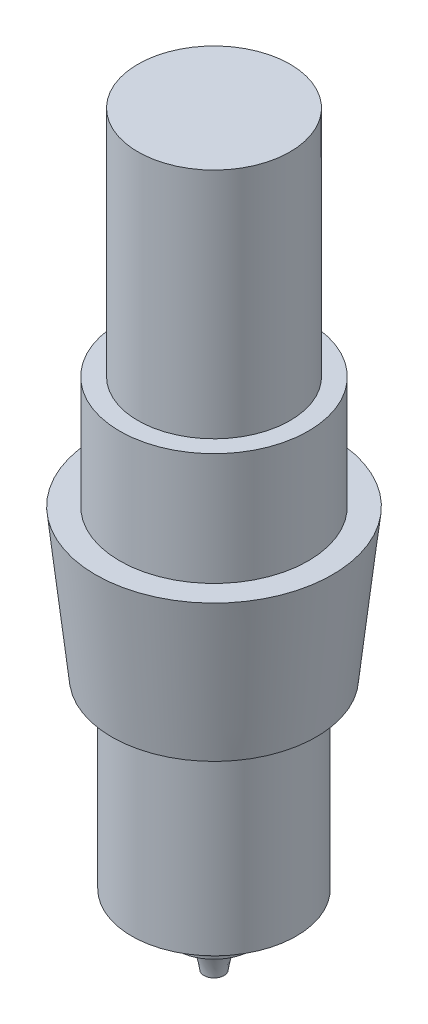
ISO-10303-21;
HEADER;
FILE_DESCRIPTION(('STEP AP214'),'2;1');
FILE_NAME('part.step','',(''),(''),'','','');
FILE_SCHEMA(('AUTOMOTIVE_DESIGN { 1 0 10303 214 1 1 1 1 }'));
ENDSEC;
DATA;
#1=APPLICATION_CONTEXT('core data for automotive mechanical design processes');
#2=APPLICATION_PROTOCOL_DEFINITION('international standard','automotive_design',2000,#1);
#3=PRODUCT_CONTEXT('',#1,'mechanical');
#4=PRODUCT('Part','Part','',(#3));
#5=PRODUCT_RELATED_PRODUCT_CATEGORY('part','',(#4));
#6=PRODUCT_DEFINITION_FORMATION('','',#4);
#7=PRODUCT_DEFINITION_CONTEXT('part definition',#1,'design');
#8=PRODUCT_DEFINITION('design','',#6,#7);
#9=PRODUCT_DEFINITION_SHAPE('','',#8);
#10=(LENGTH_UNIT() NAMED_UNIT(*) SI_UNIT(.MILLI.,.METRE.));
#11=(NAMED_UNIT(*) PLANE_ANGLE_UNIT() SI_UNIT($,.RADIAN.));
#12=(NAMED_UNIT(*) SI_UNIT($,.STERADIAN.) SOLID_ANGLE_UNIT());
#13=UNCERTAINTY_MEASURE_WITH_UNIT(LENGTH_MEASURE(1.E-05),#10,'distance_accuracy_value','');
#14=(GEOMETRIC_REPRESENTATION_CONTEXT(3) GLOBAL_UNCERTAINTY_ASSIGNED_CONTEXT((#13)) GLOBAL_UNIT_ASSIGNED_CONTEXT((#10,
#11,#12)) REPRESENTATION_CONTEXT('',''));
#15=CARTESIAN_POINT('',(0.,0.,0.));
#16=DIRECTION('',(0.,0.,1.));
#17=DIRECTION('',(1.,0.,0.));
#18=AXIS2_PLACEMENT_3D('',#15,#16,#17);
#19=CARTESIAN_POINT('',(0.,-119.,0.));
#20=DIRECTION('',(0.,-1.,0.));
#21=DIRECTION('',(0.,0.,-1.));
#22=AXIS2_PLACEMENT_3D('',#19,#20,#21);
#23=PLANE('',#22);
#24=CARTESIAN_POINT('',(0.,-119.,0.));
#25=DIRECTION('',(0.,-1.,0.));
#26=DIRECTION('',(0.,0.,-1.));
#27=AXIS2_PLACEMENT_3D('',#24,#25,#26);
#28=CIRCLE('',#27,9.5);
#29=CARTESIAN_POINT('',(6.8013965887074,-119.,6.63257148043799));
#30=VERTEX_POINT('',#29);
#31=EDGE_CURVE('E128',#30,#30,#28,.T.);
#32=ORIENTED_EDGE('',*,*,#31,.T.);
#33=EDGE_LOOP('',(#32));
#34=FACE_BOUND('',#33,.T.);
#35=CARTESIAN_POINT('',(0.,-119.,0.));
#36=DIRECTION('',(0.,-1.,0.));
#37=DIRECTION('',(0.,0.,-1.));
#38=AXIS2_PLACEMENT_3D('',#35,#36,#37);
#39=CIRCLE('',#38,5.);
#40=CARTESIAN_POINT('',(-4.99352595014576,-119.,-0.254359165788987));
#41=VERTEX_POINT('',#40);
#42=EDGE_CURVE('E141',#41,#41,#39,.T.);
#43=ORIENTED_EDGE('',*,*,#42,.F.);
#44=EDGE_LOOP('',(#43));
#45=FACE_BOUND('',#44,.T.);
#46=ADVANCED_FACE('F49',(#34,#45),#23,.T.);
#47=CARTESIAN_POINT('',(0.,58.,0.));
#48=DIRECTION('',(0.,-1.,0.));
#49=DIRECTION('',(0.,0.,-1.));
#50=AXIS2_PLACEMENT_3D('',#47,#48,#49);
#51=CYLINDRICAL_SURFACE('',#50,18.95);
#52=CARTESIAN_POINT('',(0.,58.,0.));
#53=DIRECTION('',(0.,1.,0.));
#54=DIRECTION('',(0.,0.,1.));
#55=AXIS2_PLACEMENT_3D('',#52,#53,#54);
#56=CIRCLE('',#55,18.95);
#57=CARTESIAN_POINT('',(0.,58.,-18.95));
#58=VERTEX_POINT('',#57);
#59=EDGE_CURVE('E58',#58,#58,#56,.T.);
#60=CARTESIAN_POINT('',(0.,0.,0.));
#61=DIRECTION('',(0.,1.,0.));
#62=DIRECTION('',(0.,0.,1.));
#63=AXIS2_PLACEMENT_3D('',#60,#61,#62);
#64=CIRCLE('',#63,18.95);
#65=CARTESIAN_POINT('',(0.,0.,-18.95));
#66=VERTEX_POINT('',#65);
#67=EDGE_CURVE('E64',#66,#66,#64,.T.);
#68=CARTESIAN_POINT('',(0.,58.,-18.95));
#69=CARTESIAN_POINT('',(0.,57.3958333333333,-18.95));
#70=CARTESIAN_POINT('',(0.,56.7916666666667,-18.95));
#71=CARTESIAN_POINT('',(0.,55.5833333333333,-18.95));
#72=CARTESIAN_POINT('',(0.,54.9791666666667,-18.95));
#73=CARTESIAN_POINT('',(0.,53.7708333333333,-18.95));
#74=CARTESIAN_POINT('',(0.,53.1666666666667,-18.95));
#75=CARTESIAN_POINT('',(0.,51.9583333333333,-18.95));
#76=CARTESIAN_POINT('',(0.,51.3541666666667,-18.95));
#77=CARTESIAN_POINT('',(0.,50.1458333333333,-18.95));
#78=CARTESIAN_POINT('',(0.,49.5416666666667,-18.95));
#79=CARTESIAN_POINT('',(0.,48.3333333333333,-18.95));
#80=CARTESIAN_POINT('',(0.,47.7291666666667,-18.95));
#81=CARTESIAN_POINT('',(0.,46.5208333333333,-18.95));
#82=CARTESIAN_POINT('',(0.,45.9166666666667,-18.95));
#83=CARTESIAN_POINT('',(0.,44.7083333333333,-18.95));
#84=CARTESIAN_POINT('',(0.,44.1041666666667,-18.95));
#85=CARTESIAN_POINT('',(0.,42.8958333333333,-18.95));
#86=CARTESIAN_POINT('',(0.,42.2916666666667,-18.95));
#87=CARTESIAN_POINT('',(0.,41.0833333333333,-18.95));
#88=CARTESIAN_POINT('',(0.,40.4791666666667,-18.95));
#89=CARTESIAN_POINT('',(0.,39.2708333333333,-18.95));
#90=CARTESIAN_POINT('',(0.,38.6666666666667,-18.95));
#91=CARTESIAN_POINT('',(0.,37.4583333333333,-18.95));
#92=CARTESIAN_POINT('',(0.,36.8541666666667,-18.95));
#93=CARTESIAN_POINT('',(0.,35.6458333333333,-18.95));
#94=CARTESIAN_POINT('',(0.,35.0416666666667,-18.95));
#95=CARTESIAN_POINT('',(0.,33.8333333333333,-18.95));
#96=CARTESIAN_POINT('',(0.,33.2291666666667,-18.95));
#97=CARTESIAN_POINT('',(0.,32.0208333333333,-18.95));
#98=CARTESIAN_POINT('',(0.,31.4166666666667,-18.95));
#99=CARTESIAN_POINT('',(0.,30.2083333333333,-18.95));
#100=CARTESIAN_POINT('',(0.,29.6041666666667,-18.95));
#101=CARTESIAN_POINT('',(0.,28.3958333333333,-18.95));
#102=CARTESIAN_POINT('',(0.,27.7916666666667,-18.95));
#103=CARTESIAN_POINT('',(0.,26.5833333333333,-18.95));
#104=CARTESIAN_POINT('',(0.,25.9791666666667,-18.95));
#105=CARTESIAN_POINT('',(0.,24.7708333333333,-18.95));
#106=CARTESIAN_POINT('',(0.,24.1666666666667,-18.95));
#107=CARTESIAN_POINT('',(0.,22.9583333333333,-18.95));
#108=CARTESIAN_POINT('',(0.,22.3541666666667,-18.95));
#109=CARTESIAN_POINT('',(0.,21.1458333333333,-18.95));
#110=CARTESIAN_POINT('',(0.,20.5416666666667,-18.95));
#111=CARTESIAN_POINT('',(0.,19.3333333333333,-18.95));
#112=CARTESIAN_POINT('',(0.,18.7291666666667,-18.95));
#113=CARTESIAN_POINT('',(0.,17.5208333333333,-18.95));
#114=CARTESIAN_POINT('',(0.,16.9166666666667,-18.95));
#115=CARTESIAN_POINT('',(0.,15.7083333333333,-18.95));
#116=CARTESIAN_POINT('',(0.,15.1041666666667,-18.95));
#117=CARTESIAN_POINT('',(0.,13.8958333333333,-18.95));
#118=CARTESIAN_POINT('',(0.,13.2916666666667,-18.95));
#119=CARTESIAN_POINT('',(0.,12.0833333333333,-18.95));
#120=CARTESIAN_POINT('',(0.,11.4791666666667,-18.95));
#121=CARTESIAN_POINT('',(0.,10.2708333333333,-18.95));
#122=CARTESIAN_POINT('',(0.,9.66666666666667,-18.95));
#123=CARTESIAN_POINT('',(0.,8.45833333333333,-18.95));
#124=CARTESIAN_POINT('',(0.,7.85416666666667,-18.95));
#125=CARTESIAN_POINT('',(0.,6.64583333333333,-18.95));
#126=CARTESIAN_POINT('',(0.,6.04166666666667,-18.95));
#127=CARTESIAN_POINT('',(0.,4.83333333333333,-18.95));
#128=CARTESIAN_POINT('',(0.,4.22916666666667,-18.95));
#129=CARTESIAN_POINT('',(0.,3.02083333333334,-18.95));
#130=CARTESIAN_POINT('',(0.,2.41666666666667,-18.95));
#131=CARTESIAN_POINT('',(0.,1.20833333333333,-18.95));
#132=CARTESIAN_POINT('',(0.,0.604166666666666,-18.95));
#133=CARTESIAN_POINT('',(0.,0.,-18.95));
#134=B_SPLINE_CURVE_WITH_KNOTS('',3,(#68,#69,#70,#71,#72,#73,#74,#75,#76,#77,#78,#79,#80,#81,
#82,#83,#84,#85,#86,#87,#88,#89,#90,#91,#92,#93,#94,#95,#96,#97,#98,#99,#100,#101,#102,#103,
#104,#105,#106,#107,#108,#109,#110,#111,#112,#113,#114,#115,#116,#117,#118,#119,#120,#121,#122,
#123,#124,#125,#126,#127,#128,#129,#130,#131,#132,#133),.UNSPECIFIED.,.F.,.F.,(4,2,2,2,2,2,2,2,
2,2,2,2,2,2,2,2,2,2,2,2,2,2,2,2,2,2,2,2,2,2,2,2,4),(0.,1.8125,3.625,5.4375,7.25000000000001,
9.0625,10.875,12.6875,14.5,16.3125,18.125,19.9375,21.75,23.5625,25.375,27.1875,29.,30.8125,
32.625,34.4375,36.25,38.0625,39.875,41.6875,43.5,45.3125,47.125,48.9375,50.75,52.5625,54.375,
56.1875,58.),.UNSPECIFIED.);
#135=EDGE_CURVE('BSEAM51',#58,#66,#134,.T.);
#136=ORIENTED_EDGE('',*,*,#59,.F.);
#137=ORIENTED_EDGE('',*,*,#67,.T.);
#138=ORIENTED_EDGE('',*,*,#135,.T.);
#139=ORIENTED_EDGE('',*,*,#135,.F.);
#140=EDGE_LOOP('',(#136,#138,#137,#139));
#141=FACE_BOUND('',#140,.T.);
#142=ADVANCED_FACE('F51',(#141),#51,.T.);
#143=CARTESIAN_POINT('',(0.,58.,0.));
#144=DIRECTION('',(0.,1.,0.));
#145=DIRECTION('',(0.,0.,1.));
#146=AXIS2_PLACEMENT_3D('',#143,#144,#145);
#147=PLANE('',#146);
#148=ORIENTED_EDGE('',*,*,#59,.T.);
#149=EDGE_LOOP('',(#148));
#150=FACE_BOUND('',#149,.T.);
#151=ADVANCED_FACE('F261',(#150),#147,.T.);
#152=CARTESIAN_POINT('',(0.,-28.,0.));
#153=DIRECTION('',(0.,1.,0.));
#154=DIRECTION('',(0.,0.,1.));
#155=AXIS2_PLACEMENT_3D('',#152,#153,#154);
#156=CYLINDRICAL_SURFACE('',#155,23.5);
#157=CARTESIAN_POINT('',(0.,-28.,0.));
#158=DIRECTION('',(0.,-1.,0.));
#159=DIRECTION('',(0.,0.,-1.));
#160=AXIS2_PLACEMENT_3D('',#157,#158,#159);
#161=CIRCLE('',#160,23.5);
#162=CARTESIAN_POINT('',(0.,-28.,-23.5));
#163=VERTEX_POINT('',#162);
#164=EDGE_CURVE('E116',#163,#163,#161,.T.);
#165=ORIENTED_EDGE('',*,*,#164,.F.);
#166=EDGE_LOOP('',(#165));
#167=FACE_BOUND('',#166,.T.);
#168=CARTESIAN_POINT('',(0.,0.,0.));
#169=DIRECTION('',(0.,-1.,0.));
#170=DIRECTION('',(0.,0.,-1.));
#171=AXIS2_PLACEMENT_3D('',#168,#169,#170);
#172=CIRCLE('',#171,23.5);
#173=CARTESIAN_POINT('',(0.,0.,-23.5));
#174=VERTEX_POINT('',#173);
#175=EDGE_CURVE('E113',#174,#174,#172,.T.);
#176=ORIENTED_EDGE('',*,*,#175,.T.);
#177=EDGE_LOOP('',(#176));
#178=FACE_BOUND('',#177,.T.);
#179=ADVANCED_FACE('F254',(#167,#178),#156,.T.);
#180=CARTESIAN_POINT('',(0.,0.,0.));
#181=DIRECTION('',(0.,-1.,0.));
#182=DIRECTION('',(0.,0.,-1.));
#183=AXIS2_PLACEMENT_3D('',#180,#181,#182);
#184=PLANE('',#183);
#185=ORIENTED_EDGE('',*,*,#67,.F.);
#186=EDGE_LOOP('',(#185));
#187=FACE_BOUND('',#186,.T.);
#188=ORIENTED_EDGE('',*,*,#175,.F.);
#189=EDGE_LOOP('',(#188));
#190=FACE_BOUND('',#189,.T.);
#191=ADVANCED_FACE('F99',(#187,#190),#184,.F.);
#192=CARTESIAN_POINT('',(0.,-65.,0.));
#193=DIRECTION('',(0.,-1.,0.));
#194=DIRECTION('',(0.,0.,-1.));
#195=AXIS2_PLACEMENT_3D('',#192,#193,#194);
#196=PLANE('',#195);
#197=CARTESIAN_POINT('',(0.,-65.,0.));
#198=DIRECTION('',(0.,-1.,0.));
#199=DIRECTION('',(0.,0.,-1.));
#200=AXIS2_PLACEMENT_3D('',#197,#198,#199);
#201=CIRCLE('',#200,20.5);
#202=CARTESIAN_POINT('',(0.,-65.,-20.5));
#203=VERTEX_POINT('',#202);
#204=EDGE_CURVE('E11',#203,#203,#201,.T.);
#205=ORIENTED_EDGE('',*,*,#204,.F.);
#206=EDGE_LOOP('',(#205));
#207=FACE_BOUND('',#206,.T.);
#208=CARTESIAN_POINT('',(0.,-65.,0.));
#209=DIRECTION('',(0.,-1.,0.));
#210=DIRECTION('',(0.,0.,-1.));
#211=AXIS2_PLACEMENT_3D('',#208,#209,#210);
#212=CIRCLE('',#211,25.5);
#213=CARTESIAN_POINT('',(0.,-65.,-25.5));
#214=VERTEX_POINT('',#213);
#215=EDGE_CURVE('E74',#214,#214,#212,.T.);
#216=ORIENTED_EDGE('',*,*,#215,.T.);
#217=EDGE_LOOP('',(#216));
#218=FACE_BOUND('',#217,.T.);
#219=ADVANCED_FACE('F95',(#207,#218),#196,.T.);
#220=CARTESIAN_POINT('',(0.,-28.,0.));
#221=DIRECTION('',(0.,-1.,0.));
#222=DIRECTION('',(0.,0.,-1.));
#223=AXIS2_PLACEMENT_3D('',#220,#221,#222);
#224=PLANE('',#223);
#225=ORIENTED_EDGE('',*,*,#164,.T.);
#226=EDGE_LOOP('',(#225));
#227=FACE_BOUND('',#226,.T.);
#228=CARTESIAN_POINT('',(0.,-28.,0.));
#229=DIRECTION('',(0.,-1.,0.));
#230=DIRECTION('',(0.,0.,-1.));
#231=AXIS2_PLACEMENT_3D('',#228,#229,#230);
#232=CIRCLE('',#231,29.5);
#233=CARTESIAN_POINT('',(0.,-28.,-29.5));
#234=VERTEX_POINT('',#233);
#235=EDGE_CURVE('E79',#234,#234,#232,.T.);
#236=ORIENTED_EDGE('',*,*,#235,.F.);
#237=EDGE_LOOP('',(#236));
#238=FACE_BOUND('',#237,.T.);
#239=ADVANCED_FACE('F92',(#227,#238),#224,.F.);
#240=CARTESIAN_POINT('',(0.,-65.,0.));
#241=DIRECTION('',(0.,1.,0.));
#242=DIRECTION('',(0.,0.,1.));
#243=AXIS2_PLACEMENT_3D('',#240,#241,#242);
#244=CONICAL_SURFACE('',#243,25.5,0.107689870832821);
#245=ORIENTED_EDGE('',*,*,#235,.T.);
#246=EDGE_LOOP('',(#245));
#247=FACE_BOUND('',#246,.T.);
#248=ORIENTED_EDGE('',*,*,#215,.F.);
#249=EDGE_LOOP('',(#248));
#250=FACE_BOUND('',#249,.T.);
#251=ADVANCED_FACE('F81',(#247,#250),#244,.T.);
#252=CARTESIAN_POINT('',(0.,-110.5,0.));
#253=DIRECTION('',(0.,1.,0.));
#254=DIRECTION('',(0.,0.,1.));
#255=AXIS2_PLACEMENT_3D('',#252,#253,#254);
#256=CYLINDRICAL_SURFACE('',#255,20.5);
#257=CARTESIAN_POINT('',(0.,-110.5,0.));
#258=DIRECTION('',(0.,1.,0.));
#259=DIRECTION('',(0.,0.,1.));
#260=AXIS2_PLACEMENT_3D('',#257,#258,#259);
#261=CIRCLE('',#260,20.5);
#262=CARTESIAN_POINT('',(19.3227169404993,-110.5,-6.84708770480867));
#263=VERTEX_POINT('',#262);
#264=EDGE_CURVE('E125',#263,#263,#261,.F.);
#265=ORIENTED_EDGE('',*,*,#264,.F.);
#266=EDGE_LOOP('',(#265));
#267=FACE_BOUND('',#266,.T.);
#268=ORIENTED_EDGE('',*,*,#204,.T.);
#269=EDGE_LOOP('',(#268));
#270=FACE_BOUND('',#269,.T.);
#271=ADVANCED_FACE('F91',(#267,#270),#256,.T.);
#272=CARTESIAN_POINT('',(19.3227169404993,-110.5,-6.84708770480867));
#273=CARTESIAN_POINT('',(6.8013965887074,-119.,6.63257148043799));
#274=CARTESIAN_POINT('',(33.0168923501166,-110.5,31.7983461761899));
#275=CARTESIAN_POINT('',(-6.46374637216858,-119.,20.2353646578528));
#276=CARTESIAN_POINT('',(-5.62854153088193,-110.5,45.4925215858072));
#277=CARTESIAN_POINT('',(-20.0665395495834,-119.,6.97022169697681));
#278=CARTESIAN_POINT('',(-19.3227169404993,-110.5,6.84708770480868));
#279=CARTESIAN_POINT('',(-6.8013965887074,-119.,-6.63257148043799));
#280=CARTESIAN_POINT('',(-33.0168923501166,-110.5,-31.7983461761899));
#281=CARTESIAN_POINT('',(6.46374637216858,-119.,-20.2353646578528));
#282=CARTESIAN_POINT('',(5.62854153088193,-110.5,-45.4925215858072));
#283=CARTESIAN_POINT('',(20.0665395495834,-119.,-6.9702216969768));
#284=CARTESIAN_POINT('',(19.3227169404993,-110.5,-6.84708770480867));
#285=CARTESIAN_POINT('',(6.8013965887074,-119.,6.63257148043799));
#286=(BOUNDED_SURFACE() B_SPLINE_SURFACE(3,1,((#272,#273),(#274,#275),(#276,#277),(#278,#279),
(#280,#281),(#282,#283),(#284,#285)),.UNSPECIFIED.,.T.,.F.,.F.) B_SPLINE_SURFACE_WITH_KNOTS((4,
3,4),(2,2),(0.,0.5,1.),(0.,1.),
.UNSPECIFIED.) GEOMETRIC_REPRESENTATION_ITEM() RATIONAL_B_SPLINE_SURFACE(((1.,1.),
(0.333333333333334,0.333333333333333),(0.333333333333334,0.333333333333333),(1.,1.),
(0.333333333333333,0.333333333333333),(0.333333333333333,0.333333333333333),(1.,1.))) REPRESENTATION_ITEM('') SURFACE());
#287=CARTESIAN_POINT('',(19.3227169404993,-110.5,-6.84708770480867));
#288=CARTESIAN_POINT('',(19.1922865201681,-110.588541666667,-6.70667458829568));
#289=CARTESIAN_POINT('',(19.061856099837,-110.677083333333,-6.5662614717827));
#290=CARTESIAN_POINT('',(18.8009952591746,-110.854166666667,-6.28543523875672));
#291=CARTESIAN_POINT('',(18.6705648388435,-110.942708333333,-6.14502212224374));
#292=CARTESIAN_POINT('',(18.4097039981811,-111.119791666667,-5.86419588921777));
#293=CARTESIAN_POINT('',(18.27927357785,-111.208333333333,-5.72378277270478));
#294=CARTESIAN_POINT('',(18.0184127371876,-111.385416666667,-5.44295653967881));
#295=CARTESIAN_POINT('',(17.8879823168565,-111.473958333333,-5.30254342316582));
#296=CARTESIAN_POINT('',(17.6271214761941,-111.651041666667,-5.02171719013985));
#297=CARTESIAN_POINT('',(17.496691055863,-111.739583333333,-4.88130407362686));
#298=CARTESIAN_POINT('',(17.2358302152006,-111.916666666667,-4.60047784060089));
#299=CARTESIAN_POINT('',(17.1053997948695,-112.005208333333,-4.46006472408791));
#300=CARTESIAN_POINT('',(16.8445389542071,-112.182291666667,-4.17923849106193));
#301=CARTESIAN_POINT('',(16.714108533876,-112.270833333333,-4.03882537454895));
#302=CARTESIAN_POINT('',(16.4532476932136,-112.447916666667,-3.75799914152298));
#303=CARTESIAN_POINT('',(16.3228172728825,-112.536458333333,-3.61758602500999));
#304=CARTESIAN_POINT('',(16.0619564322201,-112.713541666667,-3.33675979198402));
#305=CARTESIAN_POINT('',(15.931526011889,-112.802083333333,-3.19634667547103));
#306=CARTESIAN_POINT('',(15.6706651712266,-112.979166666667,-2.91552044244506));
#307=CARTESIAN_POINT('',(15.5402347508955,-113.067708333333,-2.77510732593207));
#308=CARTESIAN_POINT('',(15.2793739102332,-113.244791666667,-2.4942810929061));
#309=CARTESIAN_POINT('',(15.148943489902,-113.333333333333,-2.35386797639312));
#310=CARTESIAN_POINT('',(14.8880826492397,-113.510416666667,-2.07304174336714));
#311=CARTESIAN_POINT('',(14.7576522289085,-113.598958333333,-1.93262862685416));
#312=CARTESIAN_POINT('',(14.4967913882462,-113.776041666667,-1.65180239382819));
#313=CARTESIAN_POINT('',(14.366360967915,-113.864583333333,-1.5113892773152));
#314=CARTESIAN_POINT('',(14.1055001272527,-114.041666666667,-1.23056304428923));
#315=CARTESIAN_POINT('',(13.9750697069215,-114.130208333333,-1.09014992777624));
#316=CARTESIAN_POINT('',(13.7142088662592,-114.307291666667,-0.809323694750271));
#317=CARTESIAN_POINT('',(13.583778445928,-114.395833333333,-0.668910578237284));
#318=CARTESIAN_POINT('',(13.3229176052657,-114.572916666667,-0.388084345211311));
#319=CARTESIAN_POINT('',(13.1924871849345,-114.661458333333,-0.247671228698326));
#320=CARTESIAN_POINT('',(12.9316263442722,-114.838541666667,0.0331550043276463));
#321=CARTESIAN_POINT('',(12.801195923941,-114.927083333333,0.173568120840633));
#322=CARTESIAN_POINT('',(12.5403350832787,-115.104166666667,0.454394353866605));
#323=CARTESIAN_POINT('',(12.4099046629475,-115.192708333333,0.59480747037959));
#324=CARTESIAN_POINT('',(12.1490438222852,-115.369791666667,0.875633703405561));
#325=CARTESIAN_POINT('',(12.018613401954,-115.458333333333,1.01604681991855));
#326=CARTESIAN_POINT('',(11.7577525612917,-115.635416666667,1.29687305294452));
#327=CARTESIAN_POINT('',(11.6273221409605,-115.723958333333,1.43728616945751));
#328=CARTESIAN_POINT('',(11.3664613002982,-115.901041666667,1.71811240248348));
#329=CARTESIAN_POINT('',(11.236030879967,-115.989583333333,1.85852551899646));
#330=CARTESIAN_POINT('',(10.9751700393047,-116.166666666667,2.13935175202244));
#331=CARTESIAN_POINT('',(10.8447396189735,-116.255208333333,2.27976486853542));
#332=CARTESIAN_POINT('',(10.5838787783112,-116.432291666667,2.56059110156139));
#333=CARTESIAN_POINT('',(10.45344835798,-116.520833333333,2.70100421807438));
#334=CARTESIAN_POINT('',(10.1925875173177,-116.697916666667,2.98183045110035));
#335=CARTESIAN_POINT('',(10.0621570969865,-116.786458333333,3.12224356761334));
#336=CARTESIAN_POINT('',(9.8012962563242,-116.963541666667,3.40306980063931));
#337=CARTESIAN_POINT('',(9.67086583599304,-117.052083333333,3.5434829171523));
#338=CARTESIAN_POINT('',(9.41000499533071,-117.229166666667,3.82430915017827));
#339=CARTESIAN_POINT('',(9.27957457499954,-117.317708333333,3.96472226669126));
#340=CARTESIAN_POINT('',(9.01871373433721,-117.494791666667,4.24554849971723));
#341=CARTESIAN_POINT('',(8.88828331400605,-117.583333333333,4.38596161623021));
#342=CARTESIAN_POINT('',(8.62742247334371,-117.760416666667,4.66678784925618));
#343=CARTESIAN_POINT('',(8.49699205301255,-117.848958333333,4.80720096576917));
#344=CARTESIAN_POINT('',(8.23613121235022,-118.026041666667,5.08802719879514));
#345=CARTESIAN_POINT('',(8.10570079201905,-118.114583333333,5.22844031530813));
#346=CARTESIAN_POINT('',(7.84483995135672,-118.291666666667,5.5092665483341));
#347=CARTESIAN_POINT('',(7.71440953102555,-118.380208333333,5.64967966484709));
#348=CARTESIAN_POINT('',(7.45354869036322,-118.557291666667,5.93050589787306));
#349=CARTESIAN_POINT('',(7.32311827003206,-118.645833333333,6.07091901438604));
#350=CARTESIAN_POINT('',(7.06225742936973,-118.822916666667,6.35174524741202));
#351=CARTESIAN_POINT('',(6.93182700903856,-118.911458333333,6.492158363925));
#352=CARTESIAN_POINT('',(6.8013965887074,-119.,6.63257148043799));
#353=B_SPLINE_CURVE_WITH_KNOTS('',3,(#287,#288,#289,#290,#291,#292,#293,#294,#295,#296,#297,
#298,#299,#300,#301,#302,#303,#304,#305,#306,#307,#308,#309,#310,#311,#312,#313,#314,#315,#316,
#317,#318,#319,#320,#321,#322,#323,#324,#325,#326,#327,#328,#329,#330,#331,#332,#333,#334,#335,
#336,#337,#338,#339,#340,#341,#342,#343,#344,#345,#346,#347,#348,#349,#350,#351,#352),
.UNSPECIFIED.,.F.,.F.,(4,2,2,2,2,2,2,2,2,2,2,2,2,2,2,2,2,2,2,2,2,2,2,2,2,2,2,2,2,2,2,2,4),(0.,
0.633330941258113,1.26666188251622,1.89999282377433,2.53332376503244,3.16665470629055,
3.79998564754867,4.43331658880678,5.06664753006489,5.699978471323,6.33330941258111,
6.96664035383922,7.59997129509733,8.23330223635544,8.86663317761356,9.49996411887167,
10.1332950601298,10.7666260013879,11.399956942646,12.0332878839041,12.6666188251622,
13.2999497664203,13.9332807076784,14.5666116489366,15.1999425901947,15.8332735314528,
16.4666044727109,17.099935413969,17.7332663552271,18.3665972964852,18.9999282377433,
19.6332591790015,20.2665901202596),.UNSPECIFIED.);
#354=EDGE_CURVE('BSEAM160',#263,#30,#353,.T.);
#355=ORIENTED_EDGE('',*,*,#264,.T.);
#356=ORIENTED_EDGE('',*,*,#31,.F.);
#357=ORIENTED_EDGE('',*,*,#354,.T.);
#358=ORIENTED_EDGE('',*,*,#354,.F.);
#359=EDGE_LOOP('',(#355,#357,#356,#358));
#360=FACE_BOUND('',#359,.T.);
#361=ADVANCED_FACE('F160',(#360),#286,.T.);
#362=CARTESIAN_POINT('',(0.,-128.,0.));
#363=DIRECTION('',(0.,-1.,0.));
#364=DIRECTION('',(0.,0.,-1.));
#365=AXIS2_PLACEMENT_3D('',#362,#363,#364);
#366=PLANE('',#365);
#367=CARTESIAN_POINT('',(0.,-128.,0.));
#368=DIRECTION('',(0.,-1.,0.));
#369=DIRECTION('',(0.,0.,-1.));
#370=AXIS2_PLACEMENT_3D('',#367,#368,#369);
#371=CIRCLE('',#370,2.5);
#372=CARTESIAN_POINT('',(-1.7854488566652,-128.,1.7499063918487));
#373=VERTEX_POINT('',#372);
#374=EDGE_CURVE('E135',#373,#373,#371,.T.);
#375=ORIENTED_EDGE('',*,*,#374,.T.);
#376=EDGE_LOOP('',(#375));
#377=FACE_BOUND('',#376,.T.);
#378=ADVANCED_FACE('F157',(#377),#366,.T.);
#379=CARTESIAN_POINT('',(-4.99352595014576,-119.,-0.254359165788987));
#380=CARTESIAN_POINT('',(-1.7854488566652,-128.,1.7499063918487));
#381=CARTESIAN_POINT('',(-4.48480761856779,-119.,-10.2414110660805));
#382=CARTESIAN_POINT('',(-5.2852616403626,-128.,-1.82099132148169));
#383=CARTESIAN_POINT('',(5.50224428172374,-119.,-9.73269273450253));
#384=CARTESIAN_POINT('',(-1.71436392703221,-128.,-5.32080410517909));
#385=CARTESIAN_POINT('',(4.99352595014576,-119.,0.254359165788988));
#386=CARTESIAN_POINT('',(1.78544885666519,-128.,-1.7499063918487));
#387=CARTESIAN_POINT('',(4.48480761856779,-119.,10.2414110660805));
#388=CARTESIAN_POINT('',(5.2852616403626,-128.,1.82099132148169));
#389=CARTESIAN_POINT('',(-5.50224428172374,-119.,9.73269273450253));
#390=CARTESIAN_POINT('',(1.71436392703221,-128.,5.32080410517909));
#391=CARTESIAN_POINT('',(-4.99352595014576,-119.,-0.254359165788987));
#392=CARTESIAN_POINT('',(-1.7854488566652,-128.,1.7499063918487));
#393=(BOUNDED_SURFACE() B_SPLINE_SURFACE(3,1,((#379,#380),(#381,#382),(#383,#384),(#385,#386),
(#387,#388),(#389,#390),(#391,#392)),.UNSPECIFIED.,.T.,.F.,.F.) B_SPLINE_SURFACE_WITH_KNOTS((4,
3,4),(2,2),(0.,0.5,1.),(0.,1.),
.UNSPECIFIED.) GEOMETRIC_REPRESENTATION_ITEM() RATIONAL_B_SPLINE_SURFACE(((1.,1.),
(0.333333333333333,0.333333333333334),(0.333333333333333,0.333333333333334),(1.,1.),
(0.333333333333333,0.333333333333333),(0.333333333333333,0.333333333333333),(1.,1.))) REPRESENTATION_ITEM('') SURFACE());
#394=CARTESIAN_POINT('',(-4.99352595014576,-119.,-0.254359165788987));
#395=CARTESIAN_POINT('',(-4.96010848042201,-119.09375,-0.233481399563596));
#396=CARTESIAN_POINT('',(-4.92669101069825,-119.1875,-0.212603633338203));
#397=CARTESIAN_POINT('',(-4.85985607125074,-119.375,-0.170848100887417));
#398=CARTESIAN_POINT('',(-4.82643860152698,-119.46875,-0.149970334662024));
#399=CARTESIAN_POINT('',(-4.75960366207947,-119.65625,-0.108214802211238));
#400=CARTESIAN_POINT('',(-4.72618619235571,-119.75,-0.0873370359858458));
#401=CARTESIAN_POINT('',(-4.6593512529082,-119.9375,-0.0455815035350608));
#402=CARTESIAN_POINT('',(-4.62593378318445,-120.03125,-0.0247037373096683));
#403=CARTESIAN_POINT('',(-4.55909884373694,-120.21875,0.0170517951411166));
#404=CARTESIAN_POINT('',(-4.52568137401318,-120.3125,0.037929561366509));
#405=CARTESIAN_POINT('',(-4.45884643456567,-120.5,0.0796850938172939));
#406=CARTESIAN_POINT('',(-4.42542896484191,-120.59375,0.100562860042686));
#407=CARTESIAN_POINT('',(-4.3585940253944,-120.78125,0.142318392493472));
#408=CARTESIAN_POINT('',(-4.32517655567064,-120.875,0.163196158718866));
#409=CARTESIAN_POINT('',(-4.25834161622313,-121.0625,0.204951691169651));
#410=CARTESIAN_POINT('',(-4.22492414649937,-121.15625,0.225829457395043));
#411=CARTESIAN_POINT('',(-4.15808920705186,-121.34375,0.267584989845827));
#412=CARTESIAN_POINT('',(-4.12467173732811,-121.4375,0.28846275607122));
#413=CARTESIAN_POINT('',(-4.0578367978806,-121.625,0.330218288522005));
#414=CARTESIAN_POINT('',(-4.02441932815684,-121.71875,0.351096054747399));
#415=CARTESIAN_POINT('',(-3.95758438870933,-121.90625,0.392851587198184));
#416=CARTESIAN_POINT('',(-3.92416691898557,-122.,0.413729353423577));
#417=CARTESIAN_POINT('',(-3.85733197953806,-122.1875,0.455484885874362));
#418=CARTESIAN_POINT('',(-3.8239145098143,-122.28125,0.476362652099754));
#419=CARTESIAN_POINT('',(-3.75707957036679,-122.46875,0.518118184550539));
#420=CARTESIAN_POINT('',(-3.72366210064304,-122.5625,0.538995950775932));
#421=CARTESIAN_POINT('',(-3.65682716119553,-122.75,0.580751483226716));
#422=CARTESIAN_POINT('',(-3.62340969147177,-122.84375,0.601629249452109));
#423=CARTESIAN_POINT('',(-3.55657475202426,-123.03125,0.643384781902895));
#424=CARTESIAN_POINT('',(-3.5231572823005,-123.125,0.664262548128288));
#425=CARTESIAN_POINT('',(-3.45632234285299,-123.3125,0.706018080579074));
#426=CARTESIAN_POINT('',(-3.42290487312923,-123.40625,0.726895846804466));
#427=CARTESIAN_POINT('',(-3.35606993368172,-123.59375,0.76865137925525));
#428=CARTESIAN_POINT('',(-3.32265246395797,-123.6875,0.789529145480642));
#429=CARTESIAN_POINT('',(-3.25581752451046,-123.875,0.831284677931428));
#430=CARTESIAN_POINT('',(-3.2224000547867,-123.96875,0.852162444156821));
#431=CARTESIAN_POINT('',(-3.15556511533919,-124.15625,0.893917976607606));
#432=CARTESIAN_POINT('',(-3.12214764561543,-124.25,0.914795742832999));
#433=CARTESIAN_POINT('',(-3.05531270616792,-124.4375,0.956551275283784));
#434=CARTESIAN_POINT('',(-3.02189523644416,-124.53125,0.977429041509176));
#435=CARTESIAN_POINT('',(-2.95506029699665,-124.71875,1.01918457395996));
#436=CARTESIAN_POINT('',(-2.92164282727289,-124.8125,1.04006234018536));
#437=CARTESIAN_POINT('',(-2.85480788782538,-125.,1.08181787263614));
#438=CARTESIAN_POINT('',(-2.82139041810163,-125.09375,1.10269563886153));
#439=CARTESIAN_POINT('',(-2.75455547865412,-125.28125,1.14445117131232));
#440=CARTESIAN_POINT('',(-2.72113800893036,-125.375,1.16532893753771));
#441=CARTESIAN_POINT('',(-2.65430306948285,-125.5625,1.2070844699885));
#442=CARTESIAN_POINT('',(-2.62088559975909,-125.65625,1.22796223621389));
#443=CARTESIAN_POINT('',(-2.55405066031158,-125.84375,1.26971776866467));
#444=CARTESIAN_POINT('',(-2.52063319058783,-125.9375,1.29059553489006));
#445=CARTESIAN_POINT('',(-2.45379825114031,-126.125,1.33235106734085));
#446=CARTESIAN_POINT('',(-2.42038078141656,-126.21875,1.35322883356624));
#447=CARTESIAN_POINT('',(-2.35354584196904,-126.40625,1.39498436601703));
#448=CARTESIAN_POINT('',(-2.32012837224529,-126.5,1.41586213224242));
#449=CARTESIAN_POINT('',(-2.25329343279778,-126.6875,1.45761766469321));
#450=CARTESIAN_POINT('',(-2.21987596307402,-126.78125,1.4784954309186));
#451=CARTESIAN_POINT('',(-2.15304102362651,-126.96875,1.52025096336938));
#452=CARTESIAN_POINT('',(-2.11962355390276,-127.0625,1.54112872959478));
#453=CARTESIAN_POINT('',(-2.05278861445524,-127.25,1.58288426204556));
#454=CARTESIAN_POINT('',(-2.01937114473149,-127.34375,1.60376202827096));
#455=CARTESIAN_POINT('',(-1.95253620528397,-127.53125,1.64551756072174));
#456=CARTESIAN_POINT('',(-1.91911873556022,-127.625,1.66639532694713));
#457=CARTESIAN_POINT('',(-1.85228379611271,-127.8125,1.70815085939792));
#458=CARTESIAN_POINT('',(-1.81886632638895,-127.90625,1.72902862562331));
#459=CARTESIAN_POINT('',(-1.7854488566652,-128.,1.7499063918487));
#460=B_SPLINE_CURVE_WITH_KNOTS('',3,(#394,#395,#396,#397,#398,#399,#400,#401,#402,#403,#404,
#405,#406,#407,#408,#409,#410,#411,#412,#413,#414,#415,#416,#417,#418,#419,#420,#421,#422,#423,
#424,#425,#426,#427,#428,#429,#430,#431,#432,#433,#434,#435,#436,#437,#438,#439,#440,#441,#442,
#443,#444,#445,#446,#447,#448,#449,#450,#451,#452,#453,#454,#455,#456,#457,#458,#459),
.UNSPECIFIED.,.F.,.F.,(4,2,2,2,2,2,2,2,2,2,2,2,2,2,2,2,2,2,2,2,2,2,2,2,2,2,2,2,2,2,2,2,4),(0.,
0.305082018722357,0.610164037444689,0.915246056167032,1.22032807488939,1.52541009361175,
1.83049211233409,2.13557413105642,2.44065614977878,2.74573816850114,3.05082018722347,
3.35590220594581,3.66098422466817,3.96606624339053,4.27114826211287,4.5762302808352,
4.88131229955756,5.18639431827991,5.49147633700226,5.7965583557246,6.10164037444695,
6.40672239316929,6.71180441189165,7.01688643061398,7.32196844933634,7.62705046805869,
7.93213248678102,8.23721450550338,8.54229652422574,8.84737854294807,9.1524605616704,
9.45754258039276,9.76262459911511),.UNSPECIFIED.);
#461=EDGE_CURVE('BSEAM199',#41,#373,#460,.T.);
#462=ORIENTED_EDGE('',*,*,#42,.T.);
#463=ORIENTED_EDGE('',*,*,#374,.F.);
#464=ORIENTED_EDGE('',*,*,#461,.T.);
#465=ORIENTED_EDGE('',*,*,#461,.F.);
#466=EDGE_LOOP('',(#462,#464,#463,#465));
#467=FACE_BOUND('',#466,.T.);
#468=ADVANCED_FACE('F199',(#467),#393,.T.);
#469=CLOSED_SHELL('',(#46,#142,#151,#179,#191,#219,#239,#251,#271,#361,#378,#468));
#470=MANIFOLD_SOLID_BREP('B2',#469);
#471=ADVANCED_BREP_SHAPE_REPRESENTATION('',(#18,#470),#14);
#472=SHAPE_DEFINITION_REPRESENTATION(#9,#471);
ENDSEC;
END-ISO-10303-21;
